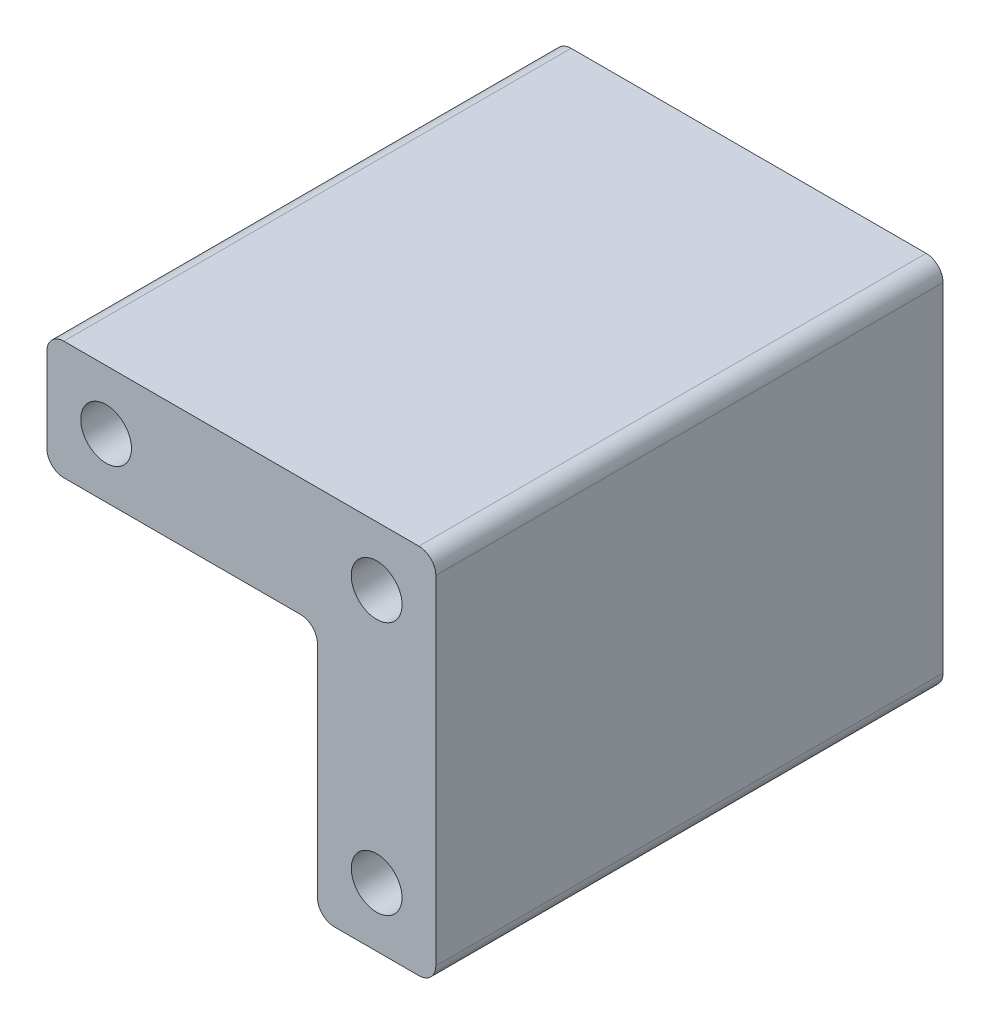
ISO-10303-21;
HEADER;
FILE_DESCRIPTION(('STEP AP214'),'2;1');
FILE_NAME('part.step','',(''),(''),'','','');
FILE_SCHEMA(('AUTOMOTIVE_DESIGN { 1 0 10303 214 1 1 1 1 }'));
ENDSEC;
DATA;
#1=APPLICATION_CONTEXT('core data for automotive mechanical design processes');
#2=APPLICATION_PROTOCOL_DEFINITION('international standard','automotive_design',2000,#1);
#3=PRODUCT_CONTEXT('',#1,'mechanical');
#4=PRODUCT('Part','Part','',(#3));
#5=PRODUCT_RELATED_PRODUCT_CATEGORY('part','',(#4));
#6=PRODUCT_DEFINITION_FORMATION('','',#4);
#7=PRODUCT_DEFINITION_CONTEXT('part definition',#1,'design');
#8=PRODUCT_DEFINITION('design','',#6,#7);
#9=PRODUCT_DEFINITION_SHAPE('','',#8);
#10=(LENGTH_UNIT() NAMED_UNIT(*) SI_UNIT(.MILLI.,.METRE.));
#11=(NAMED_UNIT(*) PLANE_ANGLE_UNIT() SI_UNIT($,.RADIAN.));
#12=(NAMED_UNIT(*) SI_UNIT($,.STERADIAN.) SOLID_ANGLE_UNIT());
#13=UNCERTAINTY_MEASURE_WITH_UNIT(LENGTH_MEASURE(1.E-05),#10,'distance_accuracy_value','');
#14=(GEOMETRIC_REPRESENTATION_CONTEXT(3) GLOBAL_UNCERTAINTY_ASSIGNED_CONTEXT((#13)) GLOBAL_UNIT_ASSIGNED_CONTEXT((#10,
#11,#12)) REPRESENTATION_CONTEXT('',''));
#15=CARTESIAN_POINT('',(0.,0.,0.));
#16=DIRECTION('',(0.,0.,1.));
#17=DIRECTION('',(1.,0.,0.));
#18=AXIS2_PLACEMENT_3D('',#15,#16,#17);
#19=CARTESIAN_POINT('',(0.,0.,30.));
#20=DIRECTION('',(0.,0.,1.));
#21=DIRECTION('',(1.,0.,0.));
#22=AXIS2_PLACEMENT_3D('',#19,#20,#21);
#23=PLANE('',#22);
#24=DIRECTION('',(0.,1.,0.));
#25=VECTOR('',#24,1.);
#26=CARTESIAN_POINT('',(4.5,-11.,30.));
#27=LINE('',#26,#25);
#28=CARTESIAN_POINT('',(4.5,-10.,30.));
#29=VERTEX_POINT('',#28);
#30=CARTESIAN_POINT('',(4.5,3.,30.));
#31=VERTEX_POINT('',#30);
#32=EDGE_CURVE('E142',#29,#31,#27,.T.);
#33=ORIENTED_EDGE('',*,*,#32,.F.);
#34=CARTESIAN_POINT('',(5.5,-10.,30.));
#35=DIRECTION('',(0.,0.,1.));
#36=DIRECTION('',(1.,0.,0.));
#37=AXIS2_PLACEMENT_3D('',#34,#35,#36);
#38=CIRCLE('',#37,1.);
#39=CARTESIAN_POINT('',(5.50000000000001,-11.,30.));
#40=VERTEX_POINT('',#39);
#41=EDGE_CURVE('E125',#29,#40,#38,.T.);
#42=ORIENTED_EDGE('',*,*,#41,.T.);
#43=DIRECTION('',(1.,0.,0.));
#44=VECTOR('',#43,1.);
#45=CARTESIAN_POINT('',(-11.5,-11.,30.));
#46=LINE('',#45,#44);
#47=CARTESIAN_POINT('',(10.5,-11.,30.));
#48=VERTEX_POINT('',#47);
#49=EDGE_CURVE('E188',#40,#48,#46,.T.);
#50=ORIENTED_EDGE('',*,*,#49,.T.);
#51=CARTESIAN_POINT('',(10.5,-10.,30.));
#52=DIRECTION('',(0.,0.,1.));
#53=DIRECTION('',(1.,0.,0.));
#54=AXIS2_PLACEMENT_3D('',#51,#52,#53);
#55=CIRCLE('',#54,1.);
#56=CARTESIAN_POINT('',(11.5,-10.,30.));
#57=VERTEX_POINT('',#56);
#58=EDGE_CURVE('E136',#48,#57,#55,.T.);
#59=ORIENTED_EDGE('',*,*,#58,.T.);
#60=DIRECTION('',(0.,1.,0.));
#61=VECTOR('',#60,1.);
#62=CARTESIAN_POINT('',(11.5,11.,30.));
#63=LINE('',#62,#61);
#64=CARTESIAN_POINT('',(11.5,10.,30.));
#65=VERTEX_POINT('',#64);
#66=EDGE_CURVE('E178',#57,#65,#63,.T.);
#67=ORIENTED_EDGE('',*,*,#66,.T.);
#68=CARTESIAN_POINT('',(10.5,10.,30.));
#69=DIRECTION('',(0.,0.,1.));
#70=DIRECTION('',(1.,0.,0.));
#71=AXIS2_PLACEMENT_3D('',#68,#69,#70);
#72=CIRCLE('',#71,1.);
#73=CARTESIAN_POINT('',(10.5,11.,30.));
#74=VERTEX_POINT('',#73);
#75=EDGE_CURVE('E203',#65,#74,#72,.T.);
#76=ORIENTED_EDGE('',*,*,#75,.T.);
#77=DIRECTION('',(-1.,0.,0.));
#78=VECTOR('',#77,1.);
#79=CARTESIAN_POINT('',(-11.5,11.,30.));
#80=LINE('',#79,#78);
#81=CARTESIAN_POINT('',(-10.5,11.,30.));
#82=VERTEX_POINT('',#81);
#83=EDGE_CURVE('E181',#74,#82,#80,.T.);
#84=ORIENTED_EDGE('',*,*,#83,.T.);
#85=CARTESIAN_POINT('',(-10.5,10.,30.));
#86=DIRECTION('',(0.,0.,1.));
#87=DIRECTION('',(1.,0.,0.));
#88=AXIS2_PLACEMENT_3D('',#85,#86,#87);
#89=CIRCLE('',#88,1.);
#90=CARTESIAN_POINT('',(-11.5,10.,30.));
#91=VERTEX_POINT('',#90);
#92=EDGE_CURVE('E201',#82,#91,#89,.T.);
#93=ORIENTED_EDGE('',*,*,#92,.T.);
#94=DIRECTION('',(0.,-1.,0.));
#95=VECTOR('',#94,1.);
#96=CARTESIAN_POINT('',(-11.5,11.,30.));
#97=LINE('',#96,#95);
#98=CARTESIAN_POINT('',(-11.5,5.,30.));
#99=VERTEX_POINT('',#98);
#100=EDGE_CURVE('E185',#91,#99,#97,.T.);
#101=ORIENTED_EDGE('',*,*,#100,.T.);
#102=CARTESIAN_POINT('',(-10.5,5.,30.));
#103=DIRECTION('',(0.,0.,1.));
#104=DIRECTION('',(1.,0.,0.));
#105=AXIS2_PLACEMENT_3D('',#102,#103,#104);
#106=CIRCLE('',#105,1.);
#107=CARTESIAN_POINT('',(-10.5,4.,30.));
#108=VERTEX_POINT('',#107);
#109=EDGE_CURVE('E146',#99,#108,#106,.T.);
#110=ORIENTED_EDGE('',*,*,#109,.T.);
#111=DIRECTION('',(-1.,0.,0.));
#112=VECTOR('',#111,1.);
#113=CARTESIAN_POINT('',(-11.5,4.,30.));
#114=LINE('',#113,#112);
#115=CARTESIAN_POINT('',(3.5,4.,30.));
#116=VERTEX_POINT('',#115);
#117=EDGE_CURVE('E151',#116,#108,#114,.T.);
#118=ORIENTED_EDGE('',*,*,#117,.F.);
#119=CARTESIAN_POINT('',(3.5,3.,30.));
#120=DIRECTION('',(0.,0.,1.));
#121=DIRECTION('',(1.,0.,0.));
#122=AXIS2_PLACEMENT_3D('',#119,#120,#121);
#123=CIRCLE('',#122,1.);
#124=EDGE_CURVE('E43',#116,#31,#123,.F.);
#125=ORIENTED_EDGE('',*,*,#124,.T.);
#126=EDGE_LOOP('',(#33,#42,#50,#59,#67,#76,#84,#93,#101,#110,#118,#125));
#127=FACE_BOUND('',#126,.T.);
#128=CARTESIAN_POINT('',(-8.,7.5,30.));
#129=DIRECTION('',(0.,0.,1.));
#130=DIRECTION('',(1.,0.,0.));
#131=AXIS2_PLACEMENT_3D('',#128,#129,#130);
#132=CIRCLE('',#131,1.5);
#133=CARTESIAN_POINT('',(-6.5,7.5,30.));
#134=VERTEX_POINT('',#133);
#135=EDGE_CURVE('E172',#134,#134,#132,.T.);
#136=ORIENTED_EDGE('',*,*,#135,.F.);
#137=EDGE_LOOP('',(#136));
#138=FACE_BOUND('',#137,.T.);
#139=CARTESIAN_POINT('',(8.,7.5,30.));
#140=DIRECTION('',(0.,0.,1.));
#141=DIRECTION('',(1.,0.,0.));
#142=AXIS2_PLACEMENT_3D('',#139,#140,#141);
#143=CIRCLE('',#142,1.5);
#144=CARTESIAN_POINT('',(9.5,7.5,30.));
#145=VERTEX_POINT('',#144);
#146=EDGE_CURVE('E166',#145,#145,#143,.T.);
#147=ORIENTED_EDGE('',*,*,#146,.F.);
#148=EDGE_LOOP('',(#147));
#149=FACE_BOUND('',#148,.T.);
#150=CARTESIAN_POINT('',(8.,-7.5,30.));
#151=DIRECTION('',(0.,0.,1.));
#152=DIRECTION('',(1.,0.,0.));
#153=AXIS2_PLACEMENT_3D('',#150,#151,#152);
#154=CIRCLE('',#153,1.5);
#155=CARTESIAN_POINT('',(9.5,-7.5,30.));
#156=VERTEX_POINT('',#155);
#157=EDGE_CURVE('E159',#156,#156,#154,.T.);
#158=ORIENTED_EDGE('',*,*,#157,.F.);
#159=EDGE_LOOP('',(#158));
#160=FACE_BOUND('',#159,.T.);
#161=ADVANCED_FACE('F35',(#127,#138,#149,#160),#23,.T.);
#162=CARTESIAN_POINT('',(0.,0.,0.));
#163=DIRECTION('',(0.,0.,1.));
#164=DIRECTION('',(1.,0.,0.));
#165=AXIS2_PLACEMENT_3D('',#162,#163,#164);
#166=PLANE('',#165);
#167=DIRECTION('',(1.,0.,0.));
#168=VECTOR('',#167,1.);
#169=CARTESIAN_POINT('',(-11.5,-11.,0.));
#170=LINE('',#169,#168);
#171=CARTESIAN_POINT('',(5.50000000000001,-11.,0.));
#172=VERTEX_POINT('',#171);
#173=CARTESIAN_POINT('',(10.5,-11.,0.));
#174=VERTEX_POINT('',#173);
#175=EDGE_CURVE('E182',#172,#174,#170,.T.);
#176=ORIENTED_EDGE('',*,*,#175,.F.);
#177=CARTESIAN_POINT('',(5.5,-10.,0.));
#178=DIRECTION('',(0.,0.,1.));
#179=DIRECTION('',(1.,0.,0.));
#180=AXIS2_PLACEMENT_3D('',#177,#178,#179);
#181=CIRCLE('',#180,1.);
#182=CARTESIAN_POINT('',(4.5,-10.,0.));
#183=VERTEX_POINT('',#182);
#184=EDGE_CURVE('E214',#172,#183,#181,.F.);
#185=ORIENTED_EDGE('',*,*,#184,.T.);
#186=DIRECTION('',(0.,1.,0.));
#187=VECTOR('',#186,1.);
#188=CARTESIAN_POINT('',(4.5,-11.,0.));
#189=LINE('',#188,#187);
#190=CARTESIAN_POINT('',(4.5,3.,0.));
#191=VERTEX_POINT('',#190);
#192=EDGE_CURVE('E145',#183,#191,#189,.T.);
#193=ORIENTED_EDGE('',*,*,#192,.T.);
#194=CARTESIAN_POINT('',(3.5,3.,0.));
#195=DIRECTION('',(0.,0.,1.));
#196=DIRECTION('',(1.,0.,0.));
#197=AXIS2_PLACEMENT_3D('',#194,#195,#196);
#198=CIRCLE('',#197,1.);
#199=CARTESIAN_POINT('',(3.5,4.,0.));
#200=VERTEX_POINT('',#199);
#201=EDGE_CURVE('E11',#191,#200,#198,.T.);
#202=ORIENTED_EDGE('',*,*,#201,.T.);
#203=DIRECTION('',(-1.,0.,0.));
#204=VECTOR('',#203,1.);
#205=CARTESIAN_POINT('',(-11.5,4.,0.));
#206=LINE('',#205,#204);
#207=CARTESIAN_POINT('',(-10.5,4.,0.));
#208=VERTEX_POINT('',#207);
#209=EDGE_CURVE('E156',#200,#208,#206,.T.);
#210=ORIENTED_EDGE('',*,*,#209,.T.);
#211=CARTESIAN_POINT('',(-10.5,5.,0.));
#212=DIRECTION('',(0.,0.,1.));
#213=DIRECTION('',(1.,0.,0.));
#214=AXIS2_PLACEMENT_3D('',#211,#212,#213);
#215=CIRCLE('',#214,1.);
#216=CARTESIAN_POINT('',(-11.5,5.,0.));
#217=VERTEX_POINT('',#216);
#218=EDGE_CURVE('E208',#208,#217,#215,.F.);
#219=ORIENTED_EDGE('',*,*,#218,.T.);
#220=DIRECTION('',(0.,-1.,0.));
#221=VECTOR('',#220,1.);
#222=CARTESIAN_POINT('',(-11.5,11.,0.));
#223=LINE('',#222,#221);
#224=CARTESIAN_POINT('',(-11.5,10.,0.));
#225=VERTEX_POINT('',#224);
#226=EDGE_CURVE('E194',#225,#217,#223,.T.);
#227=ORIENTED_EDGE('',*,*,#226,.F.);
#228=CARTESIAN_POINT('',(-10.5,10.,0.));
#229=DIRECTION('',(0.,0.,1.));
#230=DIRECTION('',(1.,0.,0.));
#231=AXIS2_PLACEMENT_3D('',#228,#229,#230);
#232=CIRCLE('',#231,1.);
#233=CARTESIAN_POINT('',(-10.5,11.,0.));
#234=VERTEX_POINT('',#233);
#235=EDGE_CURVE('E210',#225,#234,#232,.F.);
#236=ORIENTED_EDGE('',*,*,#235,.T.);
#237=DIRECTION('',(-1.,0.,0.));
#238=VECTOR('',#237,1.);
#239=CARTESIAN_POINT('',(-11.5,11.,0.));
#240=LINE('',#239,#238);
#241=CARTESIAN_POINT('',(10.5,11.,0.));
#242=VERTEX_POINT('',#241);
#243=EDGE_CURVE('E191',#242,#234,#240,.T.);
#244=ORIENTED_EDGE('',*,*,#243,.F.);
#245=CARTESIAN_POINT('',(10.5,10.,0.));
#246=DIRECTION('',(0.,0.,1.));
#247=DIRECTION('',(1.,0.,0.));
#248=AXIS2_PLACEMENT_3D('',#245,#246,#247);
#249=CIRCLE('',#248,1.);
#250=CARTESIAN_POINT('',(11.5,10.,0.));
#251=VERTEX_POINT('',#250);
#252=EDGE_CURVE('E50',#242,#251,#249,.F.);
#253=ORIENTED_EDGE('',*,*,#252,.T.);
#254=DIRECTION('',(0.,1.,0.));
#255=VECTOR('',#254,1.);
#256=CARTESIAN_POINT('',(11.5,11.,0.));
#257=LINE('',#256,#255);
#258=CARTESIAN_POINT('',(11.5,-10.,0.));
#259=VERTEX_POINT('',#258);
#260=EDGE_CURVE('E175',#259,#251,#257,.T.);
#261=ORIENTED_EDGE('',*,*,#260,.F.);
#262=CARTESIAN_POINT('',(10.5,-10.,0.));
#263=DIRECTION('',(0.,0.,1.));
#264=DIRECTION('',(1.,0.,0.));
#265=AXIS2_PLACEMENT_3D('',#262,#263,#264);
#266=CIRCLE('',#265,1.);
#267=EDGE_CURVE('E58',#259,#174,#266,.F.);
#268=ORIENTED_EDGE('',*,*,#267,.T.);
#269=EDGE_LOOP('',(#176,#185,#193,#202,#210,#219,#227,#236,#244,#253,#261,#268));
#270=FACE_BOUND('',#269,.T.);
#271=CARTESIAN_POINT('',(-8.,7.5,0.));
#272=DIRECTION('',(0.,0.,1.));
#273=DIRECTION('',(1.,0.,0.));
#274=AXIS2_PLACEMENT_3D('',#271,#272,#273);
#275=CIRCLE('',#274,1.5);
#276=CARTESIAN_POINT('',(-6.5,7.5,0.));
#277=VERTEX_POINT('',#276);
#278=EDGE_CURVE('E169',#277,#277,#275,.T.);
#279=ORIENTED_EDGE('',*,*,#278,.T.);
#280=EDGE_LOOP('',(#279));
#281=FACE_BOUND('',#280,.T.);
#282=CARTESIAN_POINT('',(8.,7.5,0.));
#283=DIRECTION('',(0.,0.,1.));
#284=DIRECTION('',(1.,0.,0.));
#285=AXIS2_PLACEMENT_3D('',#282,#283,#284);
#286=CIRCLE('',#285,1.5);
#287=CARTESIAN_POINT('',(9.5,7.5,0.));
#288=VERTEX_POINT('',#287);
#289=EDGE_CURVE('E162',#288,#288,#286,.T.);
#290=ORIENTED_EDGE('',*,*,#289,.T.);
#291=EDGE_LOOP('',(#290));
#292=FACE_BOUND('',#291,.T.);
#293=CARTESIAN_POINT('',(8.,-7.5,0.));
#294=DIRECTION('',(0.,0.,1.));
#295=DIRECTION('',(1.,0.,0.));
#296=AXIS2_PLACEMENT_3D('',#293,#294,#295);
#297=CIRCLE('',#296,1.5);
#298=CARTESIAN_POINT('',(9.5,-7.5,0.));
#299=VERTEX_POINT('',#298);
#300=EDGE_CURVE('E163',#299,#299,#297,.T.);
#301=ORIENTED_EDGE('',*,*,#300,.T.);
#302=EDGE_LOOP('',(#301));
#303=FACE_BOUND('',#302,.T.);
#304=ADVANCED_FACE('F252',(#270,#281,#292,#303),#166,.F.);
#305=CARTESIAN_POINT('',(11.5,11.,30.));
#306=DIRECTION('',(-1.,0.,0.));
#307=DIRECTION('',(0.,0.,1.));
#308=AXIS2_PLACEMENT_3D('',#305,#306,#307);
#309=PLANE('',#308);
#310=ORIENTED_EDGE('',*,*,#66,.F.);
#311=DIRECTION('',(0.,0.,-1.));
#312=VECTOR('',#311,1.);
#313=CARTESIAN_POINT('',(11.5,-10.,30.));
#314=LINE('',#313,#312);
#315=EDGE_CURVE('E218',#57,#259,#314,.T.);
#316=ORIENTED_EDGE('',*,*,#315,.T.);
#317=ORIENTED_EDGE('',*,*,#260,.T.);
#318=DIRECTION('',(0.,0.,-1.));
#319=VECTOR('',#318,1.);
#320=CARTESIAN_POINT('',(11.5,10.,30.));
#321=LINE('',#320,#319);
#322=EDGE_CURVE('E216',#251,#65,#321,.F.);
#323=ORIENTED_EDGE('',*,*,#322,.T.);
#324=EDGE_LOOP('',(#310,#316,#317,#323));
#325=FACE_BOUND('',#324,.T.);
#326=ADVANCED_FACE('F269',(#325),#309,.F.);
#327=CARTESIAN_POINT('',(-11.5,11.,30.));
#328=DIRECTION('',(0.,-1.,0.));
#329=DIRECTION('',(1.,0.,0.));
#330=AXIS2_PLACEMENT_3D('',#327,#328,#329);
#331=PLANE('',#330);
#332=ORIENTED_EDGE('',*,*,#83,.F.);
#333=DIRECTION('',(0.,0.,-1.));
#334=VECTOR('',#333,1.);
#335=CARTESIAN_POINT('',(10.5,11.,30.));
#336=LINE('',#335,#334);
#337=EDGE_CURVE('E222',#74,#242,#336,.T.);
#338=ORIENTED_EDGE('',*,*,#337,.T.);
#339=ORIENTED_EDGE('',*,*,#243,.T.);
#340=DIRECTION('',(0.,0.,-1.));
#341=VECTOR('',#340,1.);
#342=CARTESIAN_POINT('',(-10.5,11.,30.));
#343=LINE('',#342,#341);
#344=EDGE_CURVE('E220',#234,#82,#343,.F.);
#345=ORIENTED_EDGE('',*,*,#344,.T.);
#346=EDGE_LOOP('',(#332,#338,#339,#345));
#347=FACE_BOUND('',#346,.T.);
#348=ADVANCED_FACE('F281',(#347),#331,.F.);
#349=CARTESIAN_POINT('',(-11.5,11.,30.));
#350=DIRECTION('',(1.,0.,0.));
#351=DIRECTION('',(0.,1.,0.));
#352=AXIS2_PLACEMENT_3D('',#349,#350,#351);
#353=PLANE('',#352);
#354=ORIENTED_EDGE('',*,*,#100,.F.);
#355=DIRECTION('',(0.,0.,-1.));
#356=VECTOR('',#355,1.);
#357=CARTESIAN_POINT('',(-11.5,10.,30.));
#358=LINE('',#357,#356);
#359=EDGE_CURVE('E228',#91,#225,#358,.T.);
#360=ORIENTED_EDGE('',*,*,#359,.T.);
#361=ORIENTED_EDGE('',*,*,#226,.T.);
#362=DIRECTION('',(0.,0.,1.));
#363=VECTOR('',#362,1.);
#364=CARTESIAN_POINT('',(-11.5,5.,30.));
#365=LINE('',#364,#363);
#366=EDGE_CURVE('E225',#217,#99,#365,.T.);
#367=ORIENTED_EDGE('',*,*,#366,.T.);
#368=EDGE_LOOP('',(#354,#360,#361,#367));
#369=FACE_BOUND('',#368,.T.);
#370=ADVANCED_FACE('F248',(#369),#353,.F.);
#371=CARTESIAN_POINT('',(-11.5,-11.,30.));
#372=DIRECTION('',(0.,1.,0.));
#373=DIRECTION('',(-1.,0.,0.));
#374=AXIS2_PLACEMENT_3D('',#371,#372,#373);
#375=PLANE('',#374);
#376=ORIENTED_EDGE('',*,*,#49,.F.);
#377=DIRECTION('',(0.,0.,1.));
#378=VECTOR('',#377,1.);
#379=CARTESIAN_POINT('',(5.50000000000001,-11.,30.));
#380=LINE('',#379,#378);
#381=EDGE_CURVE('E130',#40,#172,#380,.F.);
#382=ORIENTED_EDGE('',*,*,#381,.T.);
#383=ORIENTED_EDGE('',*,*,#175,.T.);
#384=DIRECTION('',(0.,0.,-1.));
#385=VECTOR('',#384,1.);
#386=CARTESIAN_POINT('',(10.5,-11.,30.));
#387=LINE('',#386,#385);
#388=EDGE_CURVE('E135',#174,#48,#387,.F.);
#389=ORIENTED_EDGE('',*,*,#388,.T.);
#390=EDGE_LOOP('',(#376,#382,#383,#389));
#391=FACE_BOUND('',#390,.T.);
#392=ADVANCED_FACE('F275',(#391),#375,.F.);
#393=CARTESIAN_POINT('',(-8.,7.5,30.));
#394=DIRECTION('',(0.,0.,-1.));
#395=DIRECTION('',(-1.,0.,0.));
#396=AXIS2_PLACEMENT_3D('',#393,#394,#395);
#397=CYLINDRICAL_SURFACE('',#396,1.5);
#398=ORIENTED_EDGE('',*,*,#135,.T.);
#399=EDGE_LOOP('',(#398));
#400=FACE_BOUND('',#399,.T.);
#401=ORIENTED_EDGE('',*,*,#278,.F.);
#402=EDGE_LOOP('',(#401));
#403=FACE_BOUND('',#402,.T.);
#404=ADVANCED_FACE('F272',(#400,#403),#397,.F.);
#405=CARTESIAN_POINT('',(8.,7.5,30.));
#406=DIRECTION('',(0.,0.,-1.));
#407=DIRECTION('',(-1.,0.,0.));
#408=AXIS2_PLACEMENT_3D('',#405,#406,#407);
#409=CYLINDRICAL_SURFACE('',#408,1.5);
#410=ORIENTED_EDGE('',*,*,#146,.T.);
#411=EDGE_LOOP('',(#410));
#412=FACE_BOUND('',#411,.T.);
#413=ORIENTED_EDGE('',*,*,#289,.F.);
#414=EDGE_LOOP('',(#413));
#415=FACE_BOUND('',#414,.T.);
#416=ADVANCED_FACE('F358',(#412,#415),#409,.F.);
#417=CARTESIAN_POINT('',(8.,-7.5,30.));
#418=DIRECTION('',(0.,0.,-1.));
#419=DIRECTION('',(-1.,0.,0.));
#420=AXIS2_PLACEMENT_3D('',#417,#418,#419);
#421=CYLINDRICAL_SURFACE('',#420,1.5);
#422=ORIENTED_EDGE('',*,*,#157,.T.);
#423=EDGE_LOOP('',(#422));
#424=FACE_BOUND('',#423,.T.);
#425=ORIENTED_EDGE('',*,*,#300,.F.);
#426=EDGE_LOOP('',(#425));
#427=FACE_BOUND('',#426,.T.);
#428=ADVANCED_FACE('F349',(#424,#427),#421,.F.);
#429=CARTESIAN_POINT('',(-11.5,4.,0.));
#430=DIRECTION('',(0.,1.,0.));
#431=DIRECTION('',(0.,0.,1.));
#432=AXIS2_PLACEMENT_3D('',#429,#430,#431);
#433=PLANE('',#432);
#434=ORIENTED_EDGE('',*,*,#209,.F.);
#435=DIRECTION('',(0.,0.,1.));
#436=VECTOR('',#435,1.);
#437=CARTESIAN_POINT('',(3.5,4.,30.));
#438=LINE('',#437,#436);
#439=EDGE_CURVE('E233',#200,#116,#438,.T.);
#440=ORIENTED_EDGE('',*,*,#439,.T.);
#441=ORIENTED_EDGE('',*,*,#117,.T.);
#442=DIRECTION('',(0.,0.,1.));
#443=VECTOR('',#442,1.);
#444=CARTESIAN_POINT('',(-10.5,4.,0.));
#445=LINE('',#444,#443);
#446=EDGE_CURVE('E231',#108,#208,#445,.F.);
#447=ORIENTED_EDGE('',*,*,#446,.T.);
#448=EDGE_LOOP('',(#434,#440,#441,#447));
#449=FACE_BOUND('',#448,.T.);
#450=ADVANCED_FACE('F238',(#449),#433,.F.);
#451=CARTESIAN_POINT('',(4.5,-11.,0.));
#452=DIRECTION('',(1.,0.,0.));
#453=DIRECTION('',(0.,0.,-1.));
#454=AXIS2_PLACEMENT_3D('',#451,#452,#453);
#455=PLANE('',#454);
#456=ORIENTED_EDGE('',*,*,#192,.F.);
#457=DIRECTION('',(0.,0.,1.));
#458=VECTOR('',#457,1.);
#459=CARTESIAN_POINT('',(4.5,-10.,0.));
#460=LINE('',#459,#458);
#461=EDGE_CURVE('E129',#183,#29,#460,.T.);
#462=ORIENTED_EDGE('',*,*,#461,.T.);
#463=ORIENTED_EDGE('',*,*,#32,.T.);
#464=DIRECTION('',(0.,0.,1.));
#465=VECTOR('',#464,1.);
#466=CARTESIAN_POINT('',(4.5,3.,0.));
#467=LINE('',#466,#465);
#468=EDGE_CURVE('E147',#31,#191,#467,.F.);
#469=ORIENTED_EDGE('',*,*,#468,.T.);
#470=EDGE_LOOP('',(#456,#462,#463,#469));
#471=FACE_BOUND('',#470,.T.);
#472=ADVANCED_FACE('F141',(#471),#455,.F.);
#473=CARTESIAN_POINT('',(5.5,-10.,0.));
#474=DIRECTION('',(0.,0.,1.));
#475=DIRECTION('',(1.,0.,0.));
#476=AXIS2_PLACEMENT_3D('',#473,#474,#475);
#477=CYLINDRICAL_SURFACE('',#476,1.);
#478=ORIENTED_EDGE('',*,*,#184,.F.);
#479=ORIENTED_EDGE('',*,*,#381,.F.);
#480=ORIENTED_EDGE('',*,*,#41,.F.);
#481=ORIENTED_EDGE('',*,*,#461,.F.);
#482=EDGE_LOOP('',(#478,#479,#480,#481));
#483=FACE_BOUND('',#482,.T.);
#484=ADVANCED_FACE('F128',(#483),#477,.T.);
#485=CARTESIAN_POINT('',(10.5,-10.,30.));
#486=DIRECTION('',(0.,0.,-1.));
#487=DIRECTION('',(-1.,0.,0.));
#488=AXIS2_PLACEMENT_3D('',#485,#486,#487);
#489=CYLINDRICAL_SURFACE('',#488,1.);
#490=ORIENTED_EDGE('',*,*,#58,.F.);
#491=ORIENTED_EDGE('',*,*,#388,.F.);
#492=ORIENTED_EDGE('',*,*,#267,.F.);
#493=ORIENTED_EDGE('',*,*,#315,.F.);
#494=EDGE_LOOP('',(#490,#491,#492,#493));
#495=FACE_BOUND('',#494,.T.);
#496=ADVANCED_FACE('F290',(#495),#489,.T.);
#497=CARTESIAN_POINT('',(10.5,10.,30.));
#498=DIRECTION('',(0.,0.,-1.));
#499=DIRECTION('',(-1.,0.,0.));
#500=AXIS2_PLACEMENT_3D('',#497,#498,#499);
#501=CYLINDRICAL_SURFACE('',#500,1.);
#502=ORIENTED_EDGE('',*,*,#75,.F.);
#503=ORIENTED_EDGE('',*,*,#322,.F.);
#504=ORIENTED_EDGE('',*,*,#252,.F.);
#505=ORIENTED_EDGE('',*,*,#337,.F.);
#506=EDGE_LOOP('',(#502,#503,#504,#505));
#507=FACE_BOUND('',#506,.T.);
#508=ADVANCED_FACE('F261',(#507),#501,.T.);
#509=CARTESIAN_POINT('',(-10.5,10.,30.));
#510=DIRECTION('',(0.,0.,-1.));
#511=DIRECTION('',(-1.,0.,0.));
#512=AXIS2_PLACEMENT_3D('',#509,#510,#511);
#513=CYLINDRICAL_SURFACE('',#512,1.);
#514=ORIENTED_EDGE('',*,*,#92,.F.);
#515=ORIENTED_EDGE('',*,*,#344,.F.);
#516=ORIENTED_EDGE('',*,*,#235,.F.);
#517=ORIENTED_EDGE('',*,*,#359,.F.);
#518=EDGE_LOOP('',(#514,#515,#516,#517));
#519=FACE_BOUND('',#518,.T.);
#520=ADVANCED_FACE('F256',(#519),#513,.T.);
#521=CARTESIAN_POINT('',(3.5,3.,0.));
#522=DIRECTION('',(0.,0.,-1.));
#523=DIRECTION('',(-1.,0.,0.));
#524=AXIS2_PLACEMENT_3D('',#521,#522,#523);
#525=CYLINDRICAL_SURFACE('',#524,1.);
#526=ORIENTED_EDGE('',*,*,#201,.F.);
#527=ORIENTED_EDGE('',*,*,#468,.F.);
#528=ORIENTED_EDGE('',*,*,#124,.F.);
#529=ORIENTED_EDGE('',*,*,#439,.F.);
#530=EDGE_LOOP('',(#526,#527,#528,#529));
#531=FACE_BOUND('',#530,.T.);
#532=ADVANCED_FACE('F254',(#531),#525,.F.);
#533=CARTESIAN_POINT('',(-10.5,5.,30.));
#534=DIRECTION('',(0.,0.,1.));
#535=DIRECTION('',(1.,0.,0.));
#536=AXIS2_PLACEMENT_3D('',#533,#534,#535);
#537=CYLINDRICAL_SURFACE('',#536,1.);
#538=ORIENTED_EDGE('',*,*,#218,.F.);
#539=ORIENTED_EDGE('',*,*,#446,.F.);
#540=ORIENTED_EDGE('',*,*,#109,.F.);
#541=ORIENTED_EDGE('',*,*,#366,.F.);
#542=EDGE_LOOP('',(#538,#539,#540,#541));
#543=FACE_BOUND('',#542,.T.);
#544=ADVANCED_FACE('F37',(#543),#537,.T.);
#545=CLOSED_SHELL('',(#161,#304,#326,#348,#370,#392,#404,#416,#428,#450,#472,#484,#496,#508,
#520,#532,#544));
#546=MANIFOLD_SOLID_BREP('B2',#545);
#547=ADVANCED_BREP_SHAPE_REPRESENTATION('',(#18,#546),#14);
#548=SHAPE_DEFINITION_REPRESENTATION(#9,#547);
ENDSEC;
END-ISO-10303-21;
